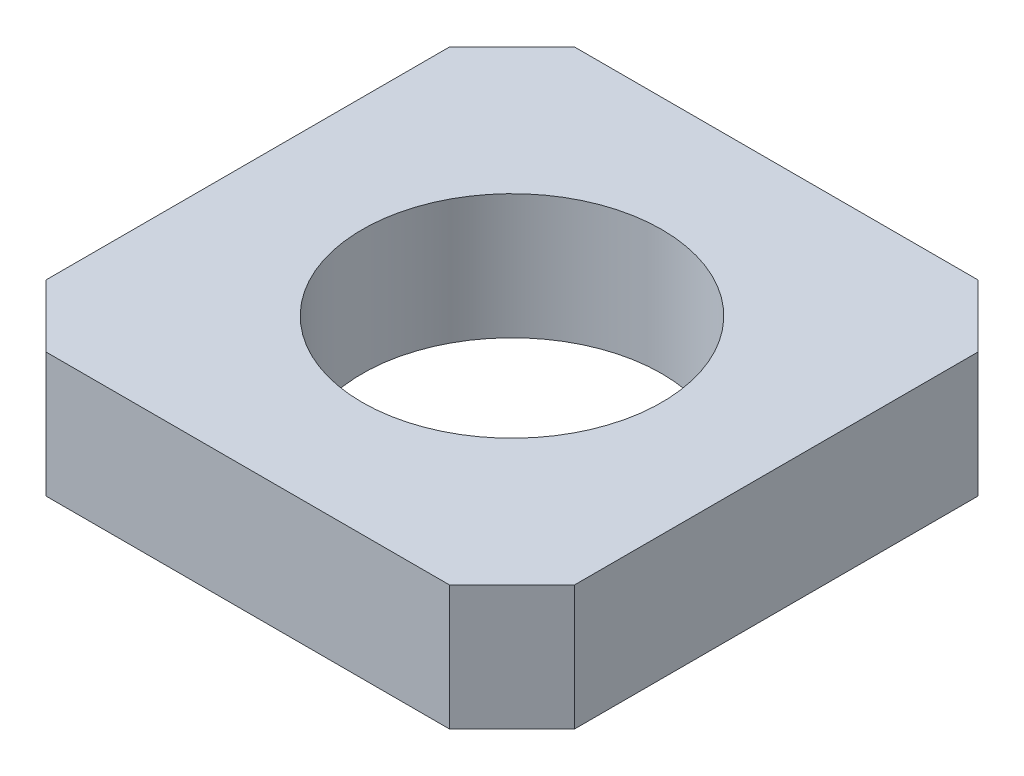
ISO-10303-21;
HEADER;
FILE_DESCRIPTION(('STEP AP214'),'2;1');
FILE_NAME('part.step','',(''),(''),'','','');
FILE_SCHEMA(('AUTOMOTIVE_DESIGN { 1 0 10303 214 1 1 1 1 }'));
ENDSEC;
DATA;
#1=APPLICATION_CONTEXT('core data for automotive mechanical design processes');
#2=APPLICATION_PROTOCOL_DEFINITION('international standard','automotive_design',2000,#1);
#3=PRODUCT_CONTEXT('',#1,'mechanical');
#4=PRODUCT('Part','Part','',(#3));
#5=PRODUCT_RELATED_PRODUCT_CATEGORY('part','',(#4));
#6=PRODUCT_DEFINITION_FORMATION('','',#4);
#7=PRODUCT_DEFINITION_CONTEXT('part definition',#1,'design');
#8=PRODUCT_DEFINITION('design','',#6,#7);
#9=PRODUCT_DEFINITION_SHAPE('','',#8);
#10=(LENGTH_UNIT() NAMED_UNIT(*) SI_UNIT(.MILLI.,.METRE.));
#11=(NAMED_UNIT(*) PLANE_ANGLE_UNIT() SI_UNIT($,.RADIAN.));
#12=(NAMED_UNIT(*) SI_UNIT($,.STERADIAN.) SOLID_ANGLE_UNIT());
#13=UNCERTAINTY_MEASURE_WITH_UNIT(LENGTH_MEASURE(1.E-05),#10,'distance_accuracy_value','');
#14=(GEOMETRIC_REPRESENTATION_CONTEXT(3) GLOBAL_UNCERTAINTY_ASSIGNED_CONTEXT((#13)) GLOBAL_UNIT_ASSIGNED_CONTEXT((#10,
#11,#12)) REPRESENTATION_CONTEXT('',''));
#15=CARTESIAN_POINT('',(0.,0.,0.));
#16=DIRECTION('',(0.,0.,1.));
#17=DIRECTION('',(1.,0.,0.));
#18=AXIS2_PLACEMENT_3D('',#15,#16,#17);
#19=CARTESIAN_POINT('',(0.,10.,0.));
#20=DIRECTION('',(0.,1.,0.));
#21=DIRECTION('',(0.,0.,1.));
#22=AXIS2_PLACEMENT_3D('',#19,#20,#21);
#23=PLANE('',#22);
#24=CARTESIAN_POINT('',(0.,10.,0.));
#25=DIRECTION('',(0.,1.,0.));
#26=DIRECTION('',(0.,0.,1.));
#27=AXIS2_PLACEMENT_3D('',#24,#25,#26);
#28=CIRCLE('',#27,12.);
#29=CARTESIAN_POINT('',(0.,10.,12.));
#30=VERTEX_POINT('',#29);
#31=EDGE_CURVE('E11',#30,#30,#28,.T.);
#32=ORIENTED_EDGE('',*,*,#31,.F.);
#33=EDGE_LOOP('',(#32));
#34=FACE_BOUND('',#33,.T.);
#35=DIRECTION('',(-0.707106781186548,0.,-0.707106781186548));
#36=VECTOR('',#35,1.);
#37=CARTESIAN_POINT('',(-21.169262219769,10.,16.169262219769));
#38=LINE('',#37,#36);
#39=CARTESIAN_POINT('',(-16.169262219769,10.,21.169262219769));
#40=VERTEX_POINT('',#39);
#41=CARTESIAN_POINT('',(-21.1692622197689,10.,16.169262219769));
#42=VERTEX_POINT('',#41);
#43=EDGE_CURVE('E113',#40,#42,#38,.T.);
#44=ORIENTED_EDGE('',*,*,#43,.F.);
#45=DIRECTION('',(-1.,0.,0.));
#46=VECTOR('',#45,1.);
#47=CARTESIAN_POINT('',(-16.169262219769,10.,21.169262219769));
#48=LINE('',#47,#46);
#49=CARTESIAN_POINT('',(16.169262219769,10.,21.169262219769));
#50=VERTEX_POINT('',#49);
#51=EDGE_CURVE('E46',#50,#40,#48,.T.);
#52=ORIENTED_EDGE('',*,*,#51,.F.);
#53=DIRECTION('',(-0.707106781186548,0.,0.707106781186548));
#54=VECTOR('',#53,1.);
#55=CARTESIAN_POINT('',(16.169262219769,10.,21.169262219769));
#56=LINE('',#55,#54);
#57=CARTESIAN_POINT('',(21.169262219769,10.,16.169262219769));
#58=VERTEX_POINT('',#57);
#59=EDGE_CURVE('E128',#58,#50,#56,.T.);
#60=ORIENTED_EDGE('',*,*,#59,.F.);
#61=DIRECTION('',(0.,0.,1.));
#62=VECTOR('',#61,1.);
#63=CARTESIAN_POINT('',(21.169262219769,10.,-16.169262219769));
#64=LINE('',#63,#62);
#65=CARTESIAN_POINT('',(21.169262219769,10.,-16.169262219769));
#66=VERTEX_POINT('',#65);
#67=EDGE_CURVE('E125',#66,#58,#64,.T.);
#68=ORIENTED_EDGE('',*,*,#67,.F.);
#69=DIRECTION('',(0.707106781186548,0.,0.707106781186548));
#70=VECTOR('',#69,1.);
#71=CARTESIAN_POINT('',(16.169262219769,10.,-21.169262219769));
#72=LINE('',#71,#70);
#73=CARTESIAN_POINT('',(16.169262219769,10.,-21.169262219769));
#74=VERTEX_POINT('',#73);
#75=EDGE_CURVE('E119',#74,#66,#72,.T.);
#76=ORIENTED_EDGE('',*,*,#75,.F.);
#77=DIRECTION('',(1.,0.,0.));
#78=VECTOR('',#77,1.);
#79=CARTESIAN_POINT('',(-16.169262219769,10.,-21.169262219769));
#80=LINE('',#79,#78);
#81=CARTESIAN_POINT('',(-16.169262219769,10.,-21.169262219769));
#82=VERTEX_POINT('',#81);
#83=EDGE_CURVE('E117',#82,#74,#80,.T.);
#84=ORIENTED_EDGE('',*,*,#83,.F.);
#85=DIRECTION('',(0.707106781186548,0.,-0.707106781186548));
#86=VECTOR('',#85,1.);
#87=CARTESIAN_POINT('',(-16.169262219769,10.,-21.169262219769));
#88=LINE('',#87,#86);
#89=CARTESIAN_POINT('',(-21.169262219769,10.,-16.169262219769));
#90=VERTEX_POINT('',#89);
#91=EDGE_CURVE('E100',#90,#82,#88,.T.);
#92=ORIENTED_EDGE('',*,*,#91,.F.);
#93=DIRECTION('',(0.,0.,-1.));
#94=VECTOR('',#93,1.);
#95=CARTESIAN_POINT('',(-21.169262219769,10.,-16.169262219769));
#96=LINE('',#95,#94);
#97=EDGE_CURVE('E108',#42,#90,#96,.T.);
#98=ORIENTED_EDGE('',*,*,#97,.F.);
#99=EDGE_LOOP('',(#44,#52,#60,#68,#76,#84,#92,#98));
#100=FACE_BOUND('',#99,.T.);
#101=ADVANCED_FACE('F31',(#34,#100),#23,.T.);
#102=CARTESIAN_POINT('',(0.,0.,0.));
#103=DIRECTION('',(0.,1.,0.));
#104=DIRECTION('',(0.,0.,1.));
#105=AXIS2_PLACEMENT_3D('',#102,#103,#104);
#106=PLANE('',#105);
#107=CARTESIAN_POINT('',(0.,0.,0.));
#108=DIRECTION('',(0.,1.,0.));
#109=DIRECTION('',(0.,0.,1.));
#110=AXIS2_PLACEMENT_3D('',#107,#108,#109);
#111=CIRCLE('',#110,12.);
#112=CARTESIAN_POINT('',(0.,0.,12.));
#113=VERTEX_POINT('',#112);
#114=EDGE_CURVE('E35',#113,#113,#111,.T.);
#115=ORIENTED_EDGE('',*,*,#114,.T.);
#116=EDGE_LOOP('',(#115));
#117=FACE_BOUND('',#116,.T.);
#118=DIRECTION('',(-1.,0.,0.));
#119=VECTOR('',#118,1.);
#120=CARTESIAN_POINT('',(-16.169262219769,0.,21.169262219769));
#121=LINE('',#120,#119);
#122=CARTESIAN_POINT('',(16.169262219769,0.,21.169262219769));
#123=VERTEX_POINT('',#122);
#124=CARTESIAN_POINT('',(-16.169262219769,0.,21.1692622197689));
#125=VERTEX_POINT('',#124);
#126=EDGE_CURVE('E132',#123,#125,#121,.T.);
#127=ORIENTED_EDGE('',*,*,#126,.T.);
#128=DIRECTION('',(-0.707106781186548,0.,-0.707106781186548));
#129=VECTOR('',#128,1.);
#130=CARTESIAN_POINT('',(-21.169262219769,0.,16.169262219769));
#131=LINE('',#130,#129);
#132=CARTESIAN_POINT('',(-21.169262219769,0.,16.169262219769));
#133=VERTEX_POINT('',#132);
#134=EDGE_CURVE('E135',#125,#133,#131,.T.);
#135=ORIENTED_EDGE('',*,*,#134,.T.);
#136=DIRECTION('',(0.,0.,-1.));
#137=VECTOR('',#136,1.);
#138=CARTESIAN_POINT('',(-21.169262219769,0.,-16.169262219769));
#139=LINE('',#138,#137);
#140=CARTESIAN_POINT('',(-21.169262219769,0.,-16.169262219769));
#141=VERTEX_POINT('',#140);
#142=EDGE_CURVE('E54',#133,#141,#139,.T.);
#143=ORIENTED_EDGE('',*,*,#142,.T.);
#144=DIRECTION('',(0.707106781186548,0.,-0.707106781186548));
#145=VECTOR('',#144,1.);
#146=CARTESIAN_POINT('',(-16.169262219769,0.,-21.169262219769));
#147=LINE('',#146,#145);
#148=CARTESIAN_POINT('',(-16.169262219769,0.,-21.169262219769));
#149=VERTEX_POINT('',#148);
#150=EDGE_CURVE('E103',#141,#149,#147,.T.);
#151=ORIENTED_EDGE('',*,*,#150,.T.);
#152=DIRECTION('',(1.,0.,0.));
#153=VECTOR('',#152,1.);
#154=CARTESIAN_POINT('',(-16.169262219769,0.,-21.169262219769));
#155=LINE('',#154,#153);
#156=CARTESIAN_POINT('',(16.169262219769,0.,-21.169262219769));
#157=VERTEX_POINT('',#156);
#158=EDGE_CURVE('E140',#149,#157,#155,.T.);
#159=ORIENTED_EDGE('',*,*,#158,.T.);
#160=DIRECTION('',(0.707106781186548,0.,0.707106781186548));
#161=VECTOR('',#160,1.);
#162=CARTESIAN_POINT('',(16.169262219769,0.,-21.169262219769));
#163=LINE('',#162,#161);
#164=CARTESIAN_POINT('',(21.169262219769,0.,-16.169262219769));
#165=VERTEX_POINT('',#164);
#166=EDGE_CURVE('E143',#157,#165,#163,.T.);
#167=ORIENTED_EDGE('',*,*,#166,.T.);
#168=DIRECTION('',(0.,0.,1.));
#169=VECTOR('',#168,1.);
#170=CARTESIAN_POINT('',(21.169262219769,0.,-16.169262219769));
#171=LINE('',#170,#169);
#172=CARTESIAN_POINT('',(21.169262219769,0.,16.169262219769));
#173=VERTEX_POINT('',#172);
#174=EDGE_CURVE('E146',#165,#173,#171,.T.);
#175=ORIENTED_EDGE('',*,*,#174,.T.);
#176=DIRECTION('',(-0.707106781186548,0.,0.707106781186548));
#177=VECTOR('',#176,1.);
#178=CARTESIAN_POINT('',(16.169262219769,0.,21.169262219769));
#179=LINE('',#178,#177);
#180=EDGE_CURVE('E149',#173,#123,#179,.T.);
#181=ORIENTED_EDGE('',*,*,#180,.T.);
#182=EDGE_LOOP('',(#127,#135,#143,#151,#159,#167,#175,#181));
#183=FACE_BOUND('',#182,.T.);
#184=ADVANCED_FACE('F33',(#117,#183),#106,.F.);
#185=CARTESIAN_POINT('',(0.,10.,0.));
#186=DIRECTION('',(0.,-1.,0.));
#187=DIRECTION('',(0.,0.,-1.));
#188=AXIS2_PLACEMENT_3D('',#185,#186,#187);
#189=CYLINDRICAL_SURFACE('',#188,12.);
#190=ORIENTED_EDGE('',*,*,#31,.T.);
#191=EDGE_LOOP('',(#190));
#192=FACE_BOUND('',#191,.T.);
#193=ORIENTED_EDGE('',*,*,#114,.F.);
#194=EDGE_LOOP('',(#193));
#195=FACE_BOUND('',#194,.T.);
#196=ADVANCED_FACE('F196',(#192,#195),#189,.F.);
#197=CARTESIAN_POINT('',(-16.169262219769,10.,21.169262219769));
#198=DIRECTION('',(0.,0.,1.));
#199=DIRECTION('',(1.,0.,0.));
#200=AXIS2_PLACEMENT_3D('',#197,#198,#199);
#201=PLANE('',#200);
#202=ORIENTED_EDGE('',*,*,#126,.F.);
#203=DIRECTION('',(0.,-1.,0.));
#204=VECTOR('',#203,1.);
#205=CARTESIAN_POINT('',(16.169262219769,10.,21.169262219769));
#206=LINE('',#205,#204);
#207=EDGE_CURVE('E152',#50,#123,#206,.T.);
#208=ORIENTED_EDGE('',*,*,#207,.F.);
#209=ORIENTED_EDGE('',*,*,#51,.T.);
#210=DIRECTION('',(0.,-1.,0.));
#211=VECTOR('',#210,1.);
#212=CARTESIAN_POINT('',(-16.169262219769,10.,21.169262219769));
#213=LINE('',#212,#211);
#214=EDGE_CURVE('E131',#40,#125,#213,.T.);
#215=ORIENTED_EDGE('',*,*,#214,.T.);
#216=EDGE_LOOP('',(#202,#208,#209,#215));
#217=FACE_BOUND('',#216,.T.);
#218=ADVANCED_FACE('F164',(#217),#201,.T.);
#219=CARTESIAN_POINT('',(16.169262219769,10.,21.169262219769));
#220=DIRECTION('',(0.707106781186548,0.,0.707106781186548));
#221=DIRECTION('',(0.707106781186548,0.,-0.707106781186548));
#222=AXIS2_PLACEMENT_3D('',#219,#220,#221);
#223=PLANE('',#222);
#224=ORIENTED_EDGE('',*,*,#180,.F.);
#225=DIRECTION('',(0.,-1.,0.));
#226=VECTOR('',#225,1.);
#227=CARTESIAN_POINT('',(21.169262219769,10.,16.169262219769));
#228=LINE('',#227,#226);
#229=EDGE_CURVE('E154',#58,#173,#228,.T.);
#230=ORIENTED_EDGE('',*,*,#229,.F.);
#231=ORIENTED_EDGE('',*,*,#59,.T.);
#232=ORIENTED_EDGE('',*,*,#207,.T.);
#233=EDGE_LOOP('',(#224,#230,#231,#232));
#234=FACE_BOUND('',#233,.T.);
#235=ADVANCED_FACE('F171',(#234),#223,.T.);
#236=CARTESIAN_POINT('',(21.169262219769,10.,-16.169262219769));
#237=DIRECTION('',(1.,0.,0.));
#238=DIRECTION('',(0.,0.,-1.));
#239=AXIS2_PLACEMENT_3D('',#236,#237,#238);
#240=PLANE('',#239);
#241=ORIENTED_EDGE('',*,*,#174,.F.);
#242=DIRECTION('',(0.,-1.,0.));
#243=VECTOR('',#242,1.);
#244=CARTESIAN_POINT('',(21.169262219769,10.,-16.169262219769));
#245=LINE('',#244,#243);
#246=EDGE_CURVE('E156',#66,#165,#245,.T.);
#247=ORIENTED_EDGE('',*,*,#246,.F.);
#248=ORIENTED_EDGE('',*,*,#67,.T.);
#249=ORIENTED_EDGE('',*,*,#229,.T.);
#250=EDGE_LOOP('',(#241,#247,#248,#249));
#251=FACE_BOUND('',#250,.T.);
#252=ADVANCED_FACE('F176',(#251),#240,.T.);
#253=CARTESIAN_POINT('',(16.169262219769,10.,-21.169262219769));
#254=DIRECTION('',(0.707106781186548,0.,-0.707106781186548));
#255=DIRECTION('',(-0.707106781186548,0.,-0.707106781186548));
#256=AXIS2_PLACEMENT_3D('',#253,#254,#255);
#257=PLANE('',#256);
#258=ORIENTED_EDGE('',*,*,#166,.F.);
#259=DIRECTION('',(0.,-1.,0.));
#260=VECTOR('',#259,1.);
#261=CARTESIAN_POINT('',(16.169262219769,10.,-21.169262219769));
#262=LINE('',#261,#260);
#263=EDGE_CURVE('E158',#74,#157,#262,.T.);
#264=ORIENTED_EDGE('',*,*,#263,.F.);
#265=ORIENTED_EDGE('',*,*,#75,.T.);
#266=ORIENTED_EDGE('',*,*,#246,.T.);
#267=EDGE_LOOP('',(#258,#264,#265,#266));
#268=FACE_BOUND('',#267,.T.);
#269=ADVANCED_FACE('F179',(#268),#257,.T.);
#270=CARTESIAN_POINT('',(-16.169262219769,10.,-21.169262219769));
#271=DIRECTION('',(0.,0.,-1.));
#272=DIRECTION('',(-1.,0.,0.));
#273=AXIS2_PLACEMENT_3D('',#270,#271,#272);
#274=PLANE('',#273);
#275=ORIENTED_EDGE('',*,*,#158,.F.);
#276=DIRECTION('',(0.,-1.,0.));
#277=VECTOR('',#276,1.);
#278=CARTESIAN_POINT('',(-16.169262219769,10.,-21.169262219769));
#279=LINE('',#278,#277);
#280=EDGE_CURVE('E104',#82,#149,#279,.T.);
#281=ORIENTED_EDGE('',*,*,#280,.F.);
#282=ORIENTED_EDGE('',*,*,#83,.T.);
#283=ORIENTED_EDGE('',*,*,#263,.T.);
#284=EDGE_LOOP('',(#275,#281,#282,#283));
#285=FACE_BOUND('',#284,.T.);
#286=ADVANCED_FACE('F182',(#285),#274,.T.);
#287=CARTESIAN_POINT('',(-16.169262219769,10.,-21.169262219769));
#288=DIRECTION('',(-0.707106781186548,0.,-0.707106781186548));
#289=DIRECTION('',(-0.707106781186548,0.,0.707106781186548));
#290=AXIS2_PLACEMENT_3D('',#287,#288,#289);
#291=PLANE('',#290);
#292=ORIENTED_EDGE('',*,*,#150,.F.);
#293=DIRECTION('',(0.,-1.,0.));
#294=VECTOR('',#293,1.);
#295=CARTESIAN_POINT('',(-21.169262219769,10.,-16.169262219769));
#296=LINE('',#295,#294);
#297=EDGE_CURVE('E96',#90,#141,#296,.T.);
#298=ORIENTED_EDGE('',*,*,#297,.F.);
#299=ORIENTED_EDGE('',*,*,#91,.T.);
#300=ORIENTED_EDGE('',*,*,#280,.T.);
#301=EDGE_LOOP('',(#292,#298,#299,#300));
#302=FACE_BOUND('',#301,.T.);
#303=ADVANCED_FACE('F98',(#302),#291,.T.);
#304=CARTESIAN_POINT('',(-21.169262219769,10.,-16.169262219769));
#305=DIRECTION('',(-1.,0.,0.));
#306=DIRECTION('',(0.,0.,1.));
#307=AXIS2_PLACEMENT_3D('',#304,#305,#306);
#308=PLANE('',#307);
#309=ORIENTED_EDGE('',*,*,#142,.F.);
#310=DIRECTION('',(0.,-1.,0.));
#311=VECTOR('',#310,1.);
#312=CARTESIAN_POINT('',(-21.169262219769,10.,16.169262219769));
#313=LINE('',#312,#311);
#314=EDGE_CURVE('E105',#42,#133,#313,.T.);
#315=ORIENTED_EDGE('',*,*,#314,.F.);
#316=ORIENTED_EDGE('',*,*,#97,.T.);
#317=ORIENTED_EDGE('',*,*,#297,.T.);
#318=EDGE_LOOP('',(#309,#315,#316,#317));
#319=FACE_BOUND('',#318,.T.);
#320=ADVANCED_FACE('F109',(#319),#308,.T.);
#321=CARTESIAN_POINT('',(-21.169262219769,10.,16.169262219769));
#322=DIRECTION('',(-0.707106781186548,0.,0.707106781186548));
#323=DIRECTION('',(0.707106781186548,0.,0.707106781186548));
#324=AXIS2_PLACEMENT_3D('',#321,#322,#323);
#325=PLANE('',#324);
#326=ORIENTED_EDGE('',*,*,#134,.F.);
#327=ORIENTED_EDGE('',*,*,#214,.F.);
#328=ORIENTED_EDGE('',*,*,#43,.T.);
#329=ORIENTED_EDGE('',*,*,#314,.T.);
#330=EDGE_LOOP('',(#326,#327,#328,#329));
#331=FACE_BOUND('',#330,.T.);
#332=ADVANCED_FACE('F166',(#331),#325,.T.);
#333=CLOSED_SHELL('',(#101,#184,#196,#218,#235,#252,#269,#286,#303,#320,#332));
#334=MANIFOLD_SOLID_BREP('B2',#333);
#335=ADVANCED_BREP_SHAPE_REPRESENTATION('',(#18,#334),#14);
#336=SHAPE_DEFINITION_REPRESENTATION(#9,#335);
ENDSEC;
END-ISO-10303-21;
